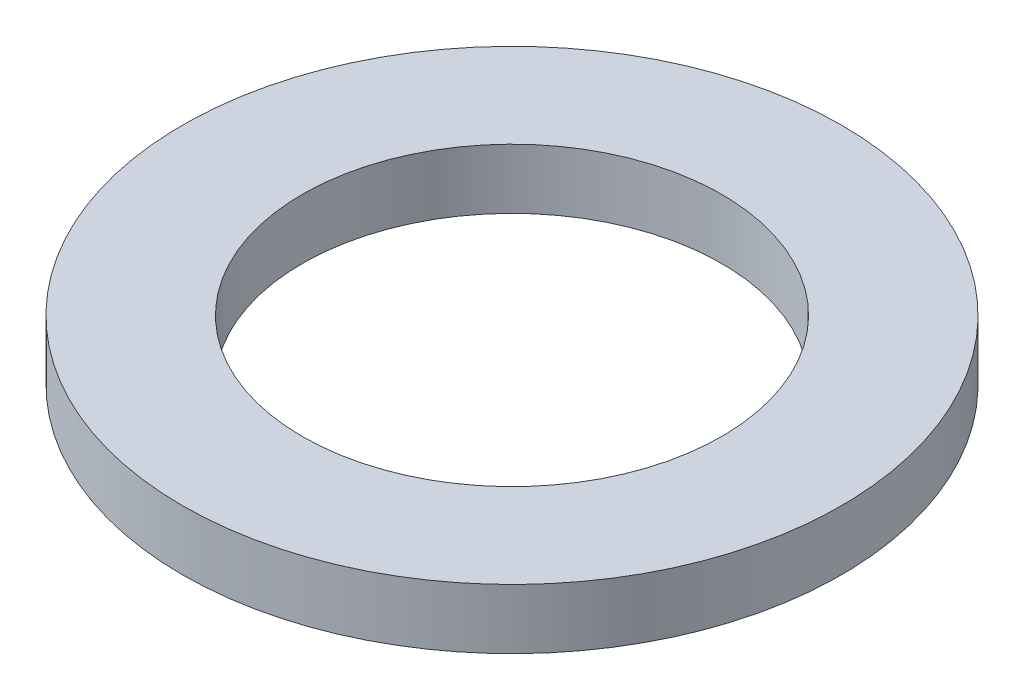
ISO-10303-21;
HEADER;
FILE_DESCRIPTION(('STEP AP214'),'2;1');
FILE_NAME('part.step','',(''),(''),'','','');
FILE_SCHEMA(('AUTOMOTIVE_DESIGN { 1 0 10303 214 1 1 1 1 }'));
ENDSEC;
DATA;
#1=APPLICATION_CONTEXT('core data for automotive mechanical design processes');
#2=APPLICATION_PROTOCOL_DEFINITION('international standard','automotive_design',2000,#1);
#3=PRODUCT_CONTEXT('',#1,'mechanical');
#4=PRODUCT('Part','Part','',(#3));
#5=PRODUCT_RELATED_PRODUCT_CATEGORY('part','',(#4));
#6=PRODUCT_DEFINITION_FORMATION('','',#4);
#7=PRODUCT_DEFINITION_CONTEXT('part definition',#1,'design');
#8=PRODUCT_DEFINITION('design','',#6,#7);
#9=PRODUCT_DEFINITION_SHAPE('','',#8);
#10=(LENGTH_UNIT() NAMED_UNIT(*) SI_UNIT(.MILLI.,.METRE.));
#11=(NAMED_UNIT(*) PLANE_ANGLE_UNIT() SI_UNIT($,.RADIAN.));
#12=(NAMED_UNIT(*) SI_UNIT($,.STERADIAN.) SOLID_ANGLE_UNIT());
#13=UNCERTAINTY_MEASURE_WITH_UNIT(LENGTH_MEASURE(1.E-05),#10,'distance_accuracy_value','');
#14=(GEOMETRIC_REPRESENTATION_CONTEXT(3) GLOBAL_UNCERTAINTY_ASSIGNED_CONTEXT((#13)) GLOBAL_UNIT_ASSIGNED_CONTEXT((#10,
#11,#12)) REPRESENTATION_CONTEXT('',''));
#15=CARTESIAN_POINT('',(0.,0.,0.));
#16=DIRECTION('',(0.,0.,1.));
#17=DIRECTION('',(1.,0.,0.));
#18=AXIS2_PLACEMENT_3D('',#15,#16,#17);
#19=CARTESIAN_POINT('',(0.,2.,0.));
#20=DIRECTION('',(0.,1.,0.));
#21=DIRECTION('',(0.,0.,1.));
#22=AXIS2_PLACEMENT_3D('',#19,#20,#21);
#23=PLANE('',#22);
#24=CARTESIAN_POINT('',(0.,2.,0.));
#25=DIRECTION('',(0.,1.,0.));
#26=DIRECTION('',(0.,0.,1.));
#27=AXIS2_PLACEMENT_3D('',#24,#25,#26);
#28=CIRCLE('',#27,11.);
#29=CARTESIAN_POINT('',(0.,2.,11.));
#30=VERTEX_POINT('',#29);
#31=EDGE_CURVE('E10',#30,#30,#28,.T.);
#32=ORIENTED_EDGE('',*,*,#31,.T.);
#33=EDGE_LOOP('',(#32));
#34=FACE_BOUND('',#33,.T.);
#35=CARTESIAN_POINT('',(0.,2.,0.));
#36=DIRECTION('',(0.,1.,0.));
#37=DIRECTION('',(0.,0.,1.));
#38=AXIS2_PLACEMENT_3D('',#35,#36,#37);
#39=CIRCLE('',#38,7.);
#40=CARTESIAN_POINT('',(0.,2.,7.));
#41=VERTEX_POINT('',#40);
#42=EDGE_CURVE('E26',#41,#41,#39,.T.);
#43=ORIENTED_EDGE('',*,*,#42,.F.);
#44=EDGE_LOOP('',(#43));
#45=FACE_BOUND('',#44,.T.);
#46=ADVANCED_FACE('F15',(#34,#45),#23,.T.);
#47=CARTESIAN_POINT('',(0.,0.,0.));
#48=DIRECTION('',(0.,1.,0.));
#49=DIRECTION('',(0.,0.,1.));
#50=AXIS2_PLACEMENT_3D('',#47,#48,#49);
#51=PLANE('',#50);
#52=CARTESIAN_POINT('',(0.,0.,0.));
#53=DIRECTION('',(0.,1.,0.));
#54=DIRECTION('',(0.,0.,1.));
#55=AXIS2_PLACEMENT_3D('',#52,#53,#54);
#56=CIRCLE('',#55,11.);
#57=CARTESIAN_POINT('',(0.,0.,11.));
#58=VERTEX_POINT('',#57);
#59=EDGE_CURVE('E19',#58,#58,#56,.T.);
#60=ORIENTED_EDGE('',*,*,#59,.F.);
#61=EDGE_LOOP('',(#60));
#62=FACE_BOUND('',#61,.T.);
#63=CARTESIAN_POINT('',(0.,0.,0.));
#64=DIRECTION('',(0.,1.,0.));
#65=DIRECTION('',(0.,0.,1.));
#66=AXIS2_PLACEMENT_3D('',#63,#64,#65);
#67=CIRCLE('',#66,7.);
#68=CARTESIAN_POINT('',(0.,0.,7.));
#69=VERTEX_POINT('',#68);
#70=EDGE_CURVE('E28',#69,#69,#67,.T.);
#71=ORIENTED_EDGE('',*,*,#70,.T.);
#72=EDGE_LOOP('',(#71));
#73=FACE_BOUND('',#72,.T.);
#74=ADVANCED_FACE('F38',(#62,#73),#51,.F.);
#75=CARTESIAN_POINT('',(0.,2.,0.));
#76=DIRECTION('',(0.,-1.,0.));
#77=DIRECTION('',(0.,0.,-1.));
#78=AXIS2_PLACEMENT_3D('',#75,#76,#77);
#79=CYLINDRICAL_SURFACE('',#78,11.);
#80=ORIENTED_EDGE('',*,*,#31,.F.);
#81=EDGE_LOOP('',(#80));
#82=FACE_BOUND('',#81,.T.);
#83=ORIENTED_EDGE('',*,*,#59,.T.);
#84=EDGE_LOOP('',(#83));
#85=FACE_BOUND('',#84,.T.);
#86=ADVANCED_FACE('F17',(#82,#85),#79,.T.);
#87=CARTESIAN_POINT('',(0.,2.,0.));
#88=DIRECTION('',(0.,-1.,0.));
#89=DIRECTION('',(0.,0.,-1.));
#90=AXIS2_PLACEMENT_3D('',#87,#88,#89);
#91=CYLINDRICAL_SURFACE('',#90,7.);
#92=ORIENTED_EDGE('',*,*,#42,.T.);
#93=EDGE_LOOP('',(#92));
#94=FACE_BOUND('',#93,.T.);
#95=ORIENTED_EDGE('',*,*,#70,.F.);
#96=EDGE_LOOP('',(#95));
#97=FACE_BOUND('',#96,.T.);
#98=ADVANCED_FACE('F34',(#94,#97),#91,.F.);
#99=CLOSED_SHELL('',(#46,#74,#86,#98));
#100=MANIFOLD_SOLID_BREP('B1',#99);
#101=ADVANCED_BREP_SHAPE_REPRESENTATION('',(#18,#100),#14);
#102=SHAPE_DEFINITION_REPRESENTATION(#9,#101);
ENDSEC;
END-ISO-10303-21;
